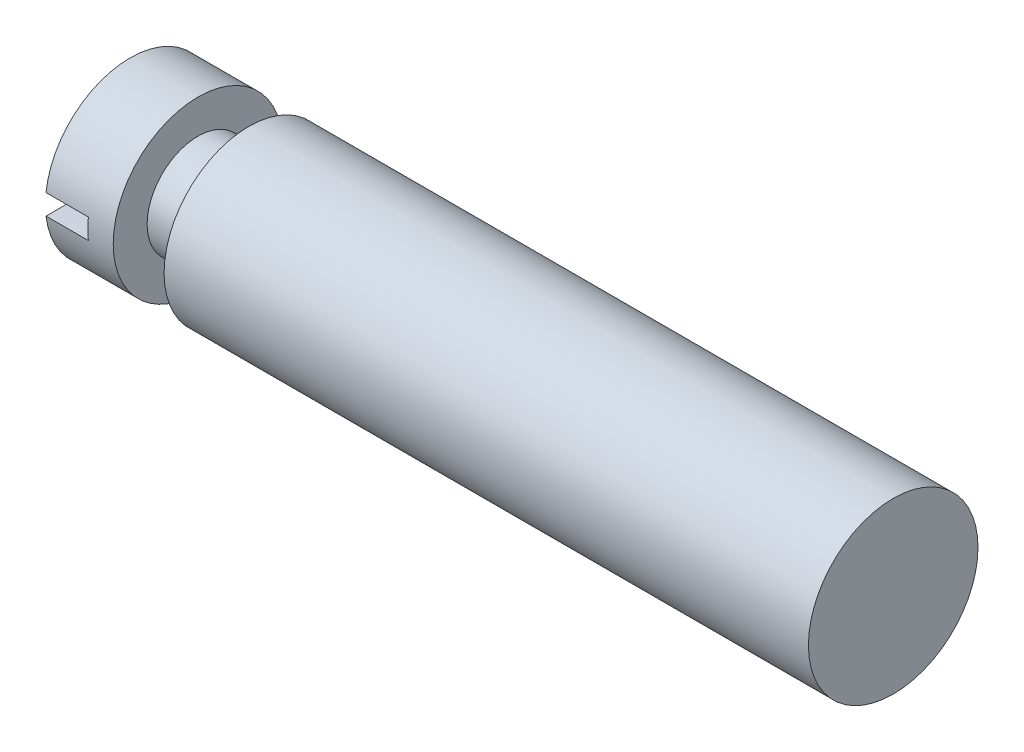
ISO-10303-21;
HEADER;
FILE_DESCRIPTION(('STEP AP214'),'2;1');
FILE_NAME('part.step','',(''),(''),'','','');
FILE_SCHEMA(('AUTOMOTIVE_DESIGN { 1 0 10303 214 1 1 1 1 }'));
ENDSEC;
DATA;
#1=APPLICATION_CONTEXT('core data for automotive mechanical design processes');
#2=APPLICATION_PROTOCOL_DEFINITION('international standard','automotive_design',2000,#1);
#3=PRODUCT_CONTEXT('',#1,'mechanical');
#4=PRODUCT('Part','Part','',(#3));
#5=PRODUCT_RELATED_PRODUCT_CATEGORY('part','',(#4));
#6=PRODUCT_DEFINITION_FORMATION('','',#4);
#7=PRODUCT_DEFINITION_CONTEXT('part definition',#1,'design');
#8=PRODUCT_DEFINITION('design','',#6,#7);
#9=PRODUCT_DEFINITION_SHAPE('','',#8);
#10=(LENGTH_UNIT() NAMED_UNIT(*) SI_UNIT(.MILLI.,.METRE.));
#11=(NAMED_UNIT(*) PLANE_ANGLE_UNIT() SI_UNIT($,.RADIAN.));
#12=(NAMED_UNIT(*) SI_UNIT($,.STERADIAN.) SOLID_ANGLE_UNIT());
#13=UNCERTAINTY_MEASURE_WITH_UNIT(LENGTH_MEASURE(1.E-05),#10,'distance_accuracy_value','');
#14=(GEOMETRIC_REPRESENTATION_CONTEXT(3) GLOBAL_UNCERTAINTY_ASSIGNED_CONTEXT((#13)) GLOBAL_UNIT_ASSIGNED_CONTEXT((#10,
#11,#12)) REPRESENTATION_CONTEXT('',''));
#15=CARTESIAN_POINT('',(0.,0.,0.));
#16=DIRECTION('',(0.,0.,1.));
#17=DIRECTION('',(1.,0.,0.));
#18=AXIS2_PLACEMENT_3D('',#15,#16,#17);
#19=CARTESIAN_POINT('',(0.,0.,0.));
#20=DIRECTION('',(1.,0.,0.));
#21=DIRECTION('',(0.,0.,-1.));
#22=AXIS2_PLACEMENT_3D('',#19,#20,#21);
#23=PLANE('',#22);
#24=CARTESIAN_POINT('',(0.,0.,0.));
#25=DIRECTION('',(-1.,0.,0.));
#26=DIRECTION('',(0.,0.,1.));
#27=AXIS2_PLACEMENT_3D('',#24,#25,#26);
#28=CIRCLE('',#27,5.);
#29=CARTESIAN_POINT('',(0.,0.6,4.96386945839634));
#30=VERTEX_POINT('',#29);
#31=CARTESIAN_POINT('',(0.,0.6,-4.96386945839634));
#32=VERTEX_POINT('',#31);
#33=EDGE_CURVE('E108',#30,#32,#28,.T.);
#34=ORIENTED_EDGE('',*,*,#33,.T.);
#35=DIRECTION('',(0.,0.,1.));
#36=VECTOR('',#35,1.);
#37=CARTESIAN_POINT('',(0.,0.6,-5.));
#38=LINE('',#37,#36);
#39=EDGE_CURVE('E124',#32,#30,#38,.T.);
#40=ORIENTED_EDGE('',*,*,#39,.T.);
#41=EDGE_LOOP('',(#34,#40));
#42=FACE_BOUND('',#41,.T.);
#43=ADVANCED_FACE('F49',(#42),#23,.F.);
#44=CARTESIAN_POINT('',(0.,-0.6,-4.96386945839634));
#45=VERTEX_POINT('',#44);
#46=CARTESIAN_POINT('',(0.,-0.6,4.96386945839634));
#47=VERTEX_POINT('',#46);
#48=EDGE_CURVE('E111',#45,#47,#28,.T.);
#49=ORIENTED_EDGE('',*,*,#48,.T.);
#50=DIRECTION('',(0.,0.,1.));
#51=VECTOR('',#50,1.);
#52=CARTESIAN_POINT('',(0.,-0.6,-5.));
#53=LINE('',#52,#51);
#54=EDGE_CURVE('E91',#45,#47,#53,.T.);
#55=ORIENTED_EDGE('',*,*,#54,.F.);
#56=EDGE_LOOP('',(#49,#55));
#57=FACE_BOUND('',#56,.T.);
#58=ADVANCED_FACE('F51',(#57),#23,.F.);
#59=CARTESIAN_POINT('',(0.,0.,0.));
#60=DIRECTION('',(-1.,0.,0.));
#61=DIRECTION('',(0.,0.,1.));
#62=AXIS2_PLACEMENT_3D('',#59,#60,#61);
#63=CYLINDRICAL_SURFACE('',#62,5.);
#64=CARTESIAN_POINT('',(2.5,0.,0.));
#65=DIRECTION('',(1.,0.,0.));
#66=DIRECTION('',(0.,0.,-1.));
#67=AXIS2_PLACEMENT_3D('',#64,#65,#66);
#68=CIRCLE('',#67,5.);
#69=CARTESIAN_POINT('',(2.5,-0.6,-4.96386945839634));
#70=VERTEX_POINT('',#69);
#71=CARTESIAN_POINT('',(2.5,0.6,-4.96386945839634));
#72=VERTEX_POINT('',#71);
#73=EDGE_CURVE('E96',#70,#72,#68,.T.);
#74=ORIENTED_EDGE('',*,*,#73,.T.);
#75=DIRECTION('',(-1.,0.,0.));
#76=VECTOR('',#75,1.);
#77=CARTESIAN_POINT('',(0.,0.6,-4.96386945839634));
#78=LINE('',#77,#76);
#79=EDGE_CURVE('E13',#72,#32,#78,.T.);
#80=ORIENTED_EDGE('',*,*,#79,.T.);
#81=ORIENTED_EDGE('',*,*,#33,.F.);
#82=DIRECTION('',(-1.,0.,0.));
#83=VECTOR('',#82,1.);
#84=CARTESIAN_POINT('',(0.,0.6,4.96386945839634));
#85=LINE('',#84,#83);
#86=CARTESIAN_POINT('',(2.5,0.6,4.96386945839634));
#87=VERTEX_POINT('',#86);
#88=EDGE_CURVE('E57',#30,#87,#85,.F.);
#89=ORIENTED_EDGE('',*,*,#88,.T.);
#90=CARTESIAN_POINT('',(2.5,-0.6,4.96386945839634));
#91=VERTEX_POINT('',#90);
#92=EDGE_CURVE('E97',#87,#91,#68,.T.);
#93=ORIENTED_EDGE('',*,*,#92,.T.);
#94=DIRECTION('',(-1.,0.,0.));
#95=VECTOR('',#94,1.);
#96=CARTESIAN_POINT('',(0.,-0.6,4.96386945839634));
#97=LINE('',#96,#95);
#98=EDGE_CURVE('E88',#91,#47,#97,.T.);
#99=ORIENTED_EDGE('',*,*,#98,.T.);
#100=ORIENTED_EDGE('',*,*,#48,.F.);
#101=DIRECTION('',(-1.,0.,0.));
#102=VECTOR('',#101,1.);
#103=CARTESIAN_POINT('',(0.,-0.6,-4.96386945839634));
#104=LINE('',#103,#102);
#105=EDGE_CURVE('E113',#45,#70,#104,.F.);
#106=ORIENTED_EDGE('',*,*,#105,.T.);
#107=EDGE_LOOP('',(#74,#80,#81,#89,#93,#99,#100,#106));
#108=FACE_BOUND('',#107,.T.);
#109=CARTESIAN_POINT('',(4.,0.,0.));
#110=DIRECTION('',(-1.,0.,0.));
#111=DIRECTION('',(0.,0.,1.));
#112=AXIS2_PLACEMENT_3D('',#109,#110,#111);
#113=CIRCLE('',#112,5.);
#114=CARTESIAN_POINT('',(4.,0.,5.));
#115=VERTEX_POINT('',#114);
#116=EDGE_CURVE('E133',#115,#115,#113,.T.);
#117=ORIENTED_EDGE('',*,*,#116,.T.);
#118=EDGE_LOOP('',(#117));
#119=FACE_BOUND('',#118,.T.);
#120=ADVANCED_FACE('F105',(#108,#119),#63,.T.);
#121=CARTESIAN_POINT('',(4.,5.,0.));
#122=DIRECTION('',(-1.,0.,0.));
#123=DIRECTION('',(0.,0.,1.));
#124=AXIS2_PLACEMENT_3D('',#121,#122,#123);
#125=PLANE('',#124);
#126=ORIENTED_EDGE('',*,*,#116,.F.);
#127=EDGE_LOOP('',(#126));
#128=FACE_BOUND('',#127,.T.);
#129=CARTESIAN_POINT('',(4.,0.,0.));
#130=DIRECTION('',(-1.,0.,0.));
#131=DIRECTION('',(0.,0.,1.));
#132=AXIS2_PLACEMENT_3D('',#129,#130,#131);
#133=CIRCLE('',#132,3.);
#134=CARTESIAN_POINT('',(4.,0.,3.));
#135=VERTEX_POINT('',#134);
#136=EDGE_CURVE('E130',#135,#135,#133,.T.);
#137=ORIENTED_EDGE('',*,*,#136,.T.);
#138=EDGE_LOOP('',(#137));
#139=FACE_BOUND('',#138,.T.);
#140=ADVANCED_FACE('F137',(#128,#139),#125,.F.);
#141=CARTESIAN_POINT('',(0.,0.,0.));
#142=DIRECTION('',(-1.,0.,0.));
#143=DIRECTION('',(0.,0.,1.));
#144=AXIS2_PLACEMENT_3D('',#141,#142,#143);
#145=CYLINDRICAL_SURFACE('',#144,3.);
#146=ORIENTED_EDGE('',*,*,#136,.F.);
#147=EDGE_LOOP('',(#146));
#148=FACE_BOUND('',#147,.T.);
#149=CARTESIAN_POINT('',(7.,0.,0.));
#150=DIRECTION('',(-1.,0.,0.));
#151=DIRECTION('',(0.,0.,1.));
#152=AXIS2_PLACEMENT_3D('',#149,#150,#151);
#153=CIRCLE('',#152,3.);
#154=CARTESIAN_POINT('',(7.,0.,3.));
#155=VERTEX_POINT('',#154);
#156=EDGE_CURVE('E127',#155,#155,#153,.T.);
#157=ORIENTED_EDGE('',*,*,#156,.T.);
#158=EDGE_LOOP('',(#157));
#159=FACE_BOUND('',#158,.T.);
#160=ADVANCED_FACE('F140',(#148,#159),#145,.T.);
#161=CARTESIAN_POINT('',(7.,3.,0.));
#162=DIRECTION('',(1.,0.,0.));
#163=DIRECTION('',(0.,0.,-1.));
#164=AXIS2_PLACEMENT_3D('',#161,#162,#163);
#165=PLANE('',#164);
#166=ORIENTED_EDGE('',*,*,#156,.F.);
#167=EDGE_LOOP('',(#166));
#168=FACE_BOUND('',#167,.T.);
#169=CARTESIAN_POINT('',(7.,0.,0.));
#170=DIRECTION('',(-1.,0.,0.));
#171=DIRECTION('',(0.,0.,1.));
#172=AXIS2_PLACEMENT_3D('',#169,#170,#171);
#173=CIRCLE('',#172,5.);
#174=CARTESIAN_POINT('',(7.,0.,5.));
#175=VERTEX_POINT('',#174);
#176=EDGE_CURVE('E123',#175,#175,#173,.T.);
#177=ORIENTED_EDGE('',*,*,#176,.T.);
#178=EDGE_LOOP('',(#177));
#179=FACE_BOUND('',#178,.T.);
#180=ADVANCED_FACE('F146',(#168,#179),#165,.F.);
#181=CARTESIAN_POINT('',(0.,0.,0.));
#182=DIRECTION('',(-1.,0.,0.));
#183=DIRECTION('',(0.,0.,1.));
#184=AXIS2_PLACEMENT_3D('',#181,#182,#183);
#185=CYLINDRICAL_SURFACE('',#184,5.);
#186=ORIENTED_EDGE('',*,*,#176,.F.);
#187=EDGE_LOOP('',(#186));
#188=FACE_BOUND('',#187,.T.);
#189=CARTESIAN_POINT('',(45.,0.,0.));
#190=DIRECTION('',(-1.,0.,0.));
#191=DIRECTION('',(0.,0.,1.));
#192=AXIS2_PLACEMENT_3D('',#189,#190,#191);
#193=CIRCLE('',#192,5.);
#194=CARTESIAN_POINT('',(45.,0.,5.));
#195=VERTEX_POINT('',#194);
#196=EDGE_CURVE('E120',#195,#195,#193,.T.);
#197=ORIENTED_EDGE('',*,*,#196,.T.);
#198=EDGE_LOOP('',(#197));
#199=FACE_BOUND('',#198,.T.);
#200=ADVANCED_FACE('F152',(#188,#199),#185,.T.);
#201=CARTESIAN_POINT('',(45.,0.,0.));
#202=DIRECTION('',(-1.,0.,0.));
#203=DIRECTION('',(0.,0.,1.));
#204=AXIS2_PLACEMENT_3D('',#201,#202,#203);
#205=PLANE('',#204);
#206=ORIENTED_EDGE('',*,*,#196,.F.);
#207=EDGE_LOOP('',(#206));
#208=FACE_BOUND('',#207,.T.);
#209=ADVANCED_FACE('F158',(#208),#205,.F.);
#210=CARTESIAN_POINT('',(0.,0.6,-5.));
#211=DIRECTION('',(0.,1.,0.));
#212=DIRECTION('',(0.,0.,1.));
#213=AXIS2_PLACEMENT_3D('',#210,#211,#212);
#214=PLANE('',#213);
#215=DIRECTION('',(0.,0.,1.));
#216=VECTOR('',#215,1.);
#217=CARTESIAN_POINT('',(2.5,0.6,-5.));
#218=LINE('',#217,#216);
#219=EDGE_CURVE('E103',#72,#87,#218,.T.);
#220=ORIENTED_EDGE('',*,*,#219,.T.);
#221=ORIENTED_EDGE('',*,*,#88,.F.);
#222=ORIENTED_EDGE('',*,*,#39,.F.);
#223=ORIENTED_EDGE('',*,*,#79,.F.);
#224=EDGE_LOOP('',(#220,#221,#222,#223));
#225=FACE_BOUND('',#224,.T.);
#226=ADVANCED_FACE('F163',(#225),#214,.F.);
#227=CARTESIAN_POINT('',(2.5,-0.6,-5.));
#228=DIRECTION('',(1.,0.,0.));
#229=DIRECTION('',(0.,0.,-1.));
#230=AXIS2_PLACEMENT_3D('',#227,#228,#229);
#231=PLANE('',#230);
#232=ORIENTED_EDGE('',*,*,#219,.F.);
#233=ORIENTED_EDGE('',*,*,#73,.F.);
#234=DIRECTION('',(0.,0.,1.));
#235=VECTOR('',#234,1.);
#236=CARTESIAN_POINT('',(2.5,-0.6,-5.));
#237=LINE('',#236,#235);
#238=EDGE_CURVE('E64',#70,#91,#237,.T.);
#239=ORIENTED_EDGE('',*,*,#238,.T.);
#240=ORIENTED_EDGE('',*,*,#92,.F.);
#241=EDGE_LOOP('',(#232,#233,#239,#240));
#242=FACE_BOUND('',#241,.T.);
#243=ADVANCED_FACE('F101',(#242),#231,.F.);
#244=CARTESIAN_POINT('',(0.,-0.6,-5.));
#245=DIRECTION('',(0.,-1.,0.));
#246=DIRECTION('',(0.,0.,-1.));
#247=AXIS2_PLACEMENT_3D('',#244,#245,#246);
#248=PLANE('',#247);
#249=ORIENTED_EDGE('',*,*,#238,.F.);
#250=ORIENTED_EDGE('',*,*,#105,.F.);
#251=ORIENTED_EDGE('',*,*,#54,.T.);
#252=ORIENTED_EDGE('',*,*,#98,.F.);
#253=EDGE_LOOP('',(#249,#250,#251,#252));
#254=FACE_BOUND('',#253,.T.);
#255=ADVANCED_FACE('F89',(#254),#248,.F.);
#256=CLOSED_SHELL('',(#43,#58,#120,#140,#160,#180,#200,#209,#226,#243,#255));
#257=MANIFOLD_SOLID_BREP('B2',#256);
#258=ADVANCED_BREP_SHAPE_REPRESENTATION('',(#18,#257),#14);
#259=SHAPE_DEFINITION_REPRESENTATION(#9,#258);
ENDSEC;
END-ISO-10303-21;
